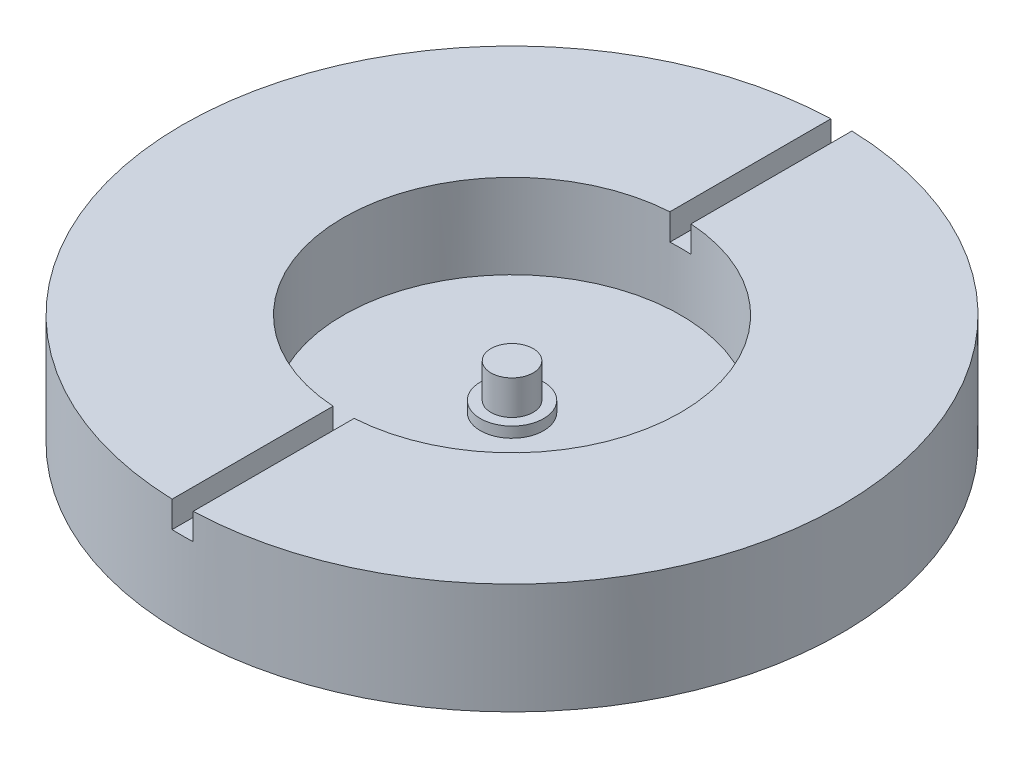
ISO-10303-21;
HEADER;
FILE_DESCRIPTION(('STEP AP214'),'2;1');
FILE_NAME('part.step','',(''),(''),'','','');
FILE_SCHEMA(('AUTOMOTIVE_DESIGN { 1 0 10303 214 1 1 1 1 }'));
ENDSEC;
DATA;
#1=APPLICATION_CONTEXT('core data for automotive mechanical design processes');
#2=APPLICATION_PROTOCOL_DEFINITION('international standard','automotive_design',2000,#1);
#3=PRODUCT_CONTEXT('',#1,'mechanical');
#4=PRODUCT('Part','Part','',(#3));
#5=PRODUCT_RELATED_PRODUCT_CATEGORY('part','',(#4));
#6=PRODUCT_DEFINITION_FORMATION('','',#4);
#7=PRODUCT_DEFINITION_CONTEXT('part definition',#1,'design');
#8=PRODUCT_DEFINITION('design','',#6,#7);
#9=PRODUCT_DEFINITION_SHAPE('','',#8);
#10=(LENGTH_UNIT() NAMED_UNIT(*) SI_UNIT(.MILLI.,.METRE.));
#11=(NAMED_UNIT(*) PLANE_ANGLE_UNIT() SI_UNIT($,.RADIAN.));
#12=(NAMED_UNIT(*) SI_UNIT($,.STERADIAN.) SOLID_ANGLE_UNIT());
#13=UNCERTAINTY_MEASURE_WITH_UNIT(LENGTH_MEASURE(1.E-05),#10,'distance_accuracy_value','');
#14=(GEOMETRIC_REPRESENTATION_CONTEXT(3) GLOBAL_UNCERTAINTY_ASSIGNED_CONTEXT((#13)) GLOBAL_UNIT_ASSIGNED_CONTEXT((#10,
#11,#12)) REPRESENTATION_CONTEXT('',''));
#15=CARTESIAN_POINT('',(0.,0.,0.));
#16=DIRECTION('',(0.,0.,1.));
#17=DIRECTION('',(1.,0.,0.));
#18=AXIS2_PLACEMENT_3D('',#15,#16,#17);
#19=CARTESIAN_POINT('',(0.,21.,0.));
#20=DIRECTION('',(0.,1.,0.));
#21=DIRECTION('',(0.,0.,1.));
#22=AXIS2_PLACEMENT_3D('',#19,#20,#21);
#23=PLANE('',#22);
#24=DIRECTION('',(0.,0.,-1.));
#25=VECTOR('',#24,1.);
#26=CARTESIAN_POINT('',(2.,21.,-62.467991803803));
#27=LINE('',#26,#25);
#28=CARTESIAN_POINT('',(2.,21.,62.467991803803));
#29=VERTEX_POINT('',#28);
#30=CARTESIAN_POINT('',(2.,21.,31.9374388453426));
#31=VERTEX_POINT('',#30);
#32=EDGE_CURVE('E113',#29,#31,#27,.T.);
#33=ORIENTED_EDGE('',*,*,#32,.F.);
#34=CARTESIAN_POINT('',(0.,21.,0.));
#35=DIRECTION('',(0.,1.,0.));
#36=DIRECTION('',(0.,0.,1.));
#37=AXIS2_PLACEMENT_3D('',#34,#35,#36);
#38=CIRCLE('',#37,62.5);
#39=CARTESIAN_POINT('',(2.,21.,-62.467991803803));
#40=VERTEX_POINT('',#39);
#41=EDGE_CURVE('E148',#29,#40,#38,.T.);
#42=ORIENTED_EDGE('',*,*,#41,.T.);
#43=CARTESIAN_POINT('',(2.,21.,-31.9374388453426));
#44=VERTEX_POINT('',#43);
#45=EDGE_CURVE('E174',#44,#40,#27,.T.);
#46=ORIENTED_EDGE('',*,*,#45,.F.);
#47=CARTESIAN_POINT('',(0.,21.,0.));
#48=DIRECTION('',(0.,1.,0.));
#49=DIRECTION('',(0.,0.,1.));
#50=AXIS2_PLACEMENT_3D('',#47,#48,#49);
#51=CIRCLE('',#50,32.);
#52=EDGE_CURVE('E145',#31,#44,#51,.T.);
#53=ORIENTED_EDGE('',*,*,#52,.F.);
#54=EDGE_LOOP('',(#33,#42,#46,#53));
#55=FACE_BOUND('',#54,.T.);
#56=ADVANCED_FACE('F33',(#55),#23,.T.);
#57=CARTESIAN_POINT('',(0.,7.,0.));
#58=DIRECTION('',(0.,1.,0.));
#59=DIRECTION('',(0.,0.,1.));
#60=AXIS2_PLACEMENT_3D('',#57,#58,#59);
#61=CYLINDRICAL_SURFACE('',#60,4.);
#62=CARTESIAN_POINT('',(0.,7.,0.));
#63=DIRECTION('',(0.,1.,0.));
#64=DIRECTION('',(0.,0.,1.));
#65=AXIS2_PLACEMENT_3D('',#62,#63,#64);
#66=CIRCLE('',#65,4.);
#67=CARTESIAN_POINT('',(0.,7.,4.));
#68=VERTEX_POINT('',#67);
#69=EDGE_CURVE('E130',#68,#68,#66,.T.);
#70=CARTESIAN_POINT('',(0.,13.5,0.));
#71=DIRECTION('',(0.,1.,0.));
#72=DIRECTION('',(0.,0.,1.));
#73=AXIS2_PLACEMENT_3D('',#70,#71,#72);
#74=CIRCLE('',#73,4.);
#75=CARTESIAN_POINT('',(0.,13.5,4.));
#76=VERTEX_POINT('',#75);
#77=EDGE_CURVE('E127',#76,#76,#74,.T.);
#78=CARTESIAN_POINT('',(0.,7.,4.));
#79=CARTESIAN_POINT('',(0.,7.06770833333334,4.));
#80=CARTESIAN_POINT('',(0.,7.13541666666667,4.));
#81=CARTESIAN_POINT('',(0.,7.27083333333334,4.));
#82=CARTESIAN_POINT('',(0.,7.33854166666667,4.));
#83=CARTESIAN_POINT('',(0.,7.47395833333334,4.));
#84=CARTESIAN_POINT('',(0.,7.54166666666667,4.));
#85=CARTESIAN_POINT('',(0.,7.67708333333333,4.));
#86=CARTESIAN_POINT('',(0.,7.74479166666667,4.));
#87=CARTESIAN_POINT('',(0.,7.88020833333333,4.));
#88=CARTESIAN_POINT('',(0.,7.94791666666667,4.));
#89=CARTESIAN_POINT('',(0.,8.08333333333333,4.));
#90=CARTESIAN_POINT('',(0.,8.15104166666667,4.));
#91=CARTESIAN_POINT('',(0.,8.28645833333334,4.));
#92=CARTESIAN_POINT('',(0.,8.35416666666667,4.));
#93=CARTESIAN_POINT('',(0.,8.48958333333334,4.));
#94=CARTESIAN_POINT('',(0.,8.55729166666667,4.));
#95=CARTESIAN_POINT('',(0.,8.69270833333334,4.));
#96=CARTESIAN_POINT('',(0.,8.76041666666667,4.));
#97=CARTESIAN_POINT('',(0.,8.89583333333334,4.));
#98=CARTESIAN_POINT('',(0.,8.96354166666667,4.));
#99=CARTESIAN_POINT('',(0.,9.09895833333333,4.));
#100=CARTESIAN_POINT('',(0.,9.16666666666667,4.));
#101=CARTESIAN_POINT('',(0.,9.30208333333333,4.));
#102=CARTESIAN_POINT('',(0.,9.36979166666667,4.));
#103=CARTESIAN_POINT('',(0.,9.50520833333333,4.));
#104=CARTESIAN_POINT('',(0.,9.57291666666667,4.));
#105=CARTESIAN_POINT('',(0.,9.70833333333333,4.));
#106=CARTESIAN_POINT('',(0.,9.77604166666667,4.));
#107=CARTESIAN_POINT('',(0.,9.91145833333333,4.));
#108=CARTESIAN_POINT('',(0.,9.97916666666667,4.));
#109=CARTESIAN_POINT('',(0.,10.1145833333333,4.));
#110=CARTESIAN_POINT('',(0.,10.1822916666667,4.));
#111=CARTESIAN_POINT('',(0.,10.3177083333333,4.));
#112=CARTESIAN_POINT('',(0.,10.3854166666667,4.));
#113=CARTESIAN_POINT('',(0.,10.5208333333333,4.));
#114=CARTESIAN_POINT('',(0.,10.5885416666667,4.));
#115=CARTESIAN_POINT('',(0.,10.7239583333333,4.));
#116=CARTESIAN_POINT('',(0.,10.7916666666667,4.));
#117=CARTESIAN_POINT('',(0.,10.9270833333333,4.));
#118=CARTESIAN_POINT('',(0.,10.9947916666667,4.));
#119=CARTESIAN_POINT('',(0.,11.1302083333333,4.));
#120=CARTESIAN_POINT('',(0.,11.1979166666667,4.));
#121=CARTESIAN_POINT('',(0.,11.3333333333333,4.));
#122=CARTESIAN_POINT('',(0.,11.4010416666667,4.));
#123=CARTESIAN_POINT('',(0.,11.5364583333333,4.));
#124=CARTESIAN_POINT('',(0.,11.6041666666667,4.));
#125=CARTESIAN_POINT('',(0.,11.7395833333333,4.));
#126=CARTESIAN_POINT('',(0.,11.8072916666667,4.));
#127=CARTESIAN_POINT('',(0.,11.9427083333333,4.));
#128=CARTESIAN_POINT('',(0.,12.0104166666667,4.));
#129=CARTESIAN_POINT('',(0.,12.1458333333333,4.));
#130=CARTESIAN_POINT('',(0.,12.2135416666667,4.));
#131=CARTESIAN_POINT('',(0.,12.3489583333333,4.));
#132=CARTESIAN_POINT('',(0.,12.4166666666667,4.));
#133=CARTESIAN_POINT('',(0.,12.5520833333333,4.));
#134=CARTESIAN_POINT('',(0.,12.6197916666667,4.));
#135=CARTESIAN_POINT('',(0.,12.7552083333333,4.));
#136=CARTESIAN_POINT('',(0.,12.8229166666667,4.));
#137=CARTESIAN_POINT('',(0.,12.9583333333333,4.));
#138=CARTESIAN_POINT('',(0.,13.0260416666667,4.));
#139=CARTESIAN_POINT('',(0.,13.1614583333333,4.));
#140=CARTESIAN_POINT('',(0.,13.2291666666667,4.));
#141=CARTESIAN_POINT('',(0.,13.3645833333333,4.));
#142=CARTESIAN_POINT('',(0.,13.4322916666667,4.));
#143=CARTESIAN_POINT('',(0.,13.5,4.));
#144=B_SPLINE_CURVE_WITH_KNOTS('',3,(#78,#79,#80,#81,#82,#83,#84,#85,#86,#87,#88,#89,#90,#91,
#92,#93,#94,#95,#96,#97,#98,#99,#100,#101,#102,#103,#104,#105,#106,#107,#108,#109,#110,#111,
#112,#113,#114,#115,#116,#117,#118,#119,#120,#121,#122,#123,#124,#125,#126,#127,#128,#129,#130,
#131,#132,#133,#134,#135,#136,#137,#138,#139,#140,#141,#142,#143),.UNSPECIFIED.,.F.,.F.,(4,2,2,
2,2,2,2,2,2,2,2,2,2,2,2,2,2,2,2,2,2,2,2,2,2,2,2,2,2,2,2,2,4),(0.,0.203124999999999,0.40625,
0.609375,0.812499999999999,1.015625,1.21875,1.421875,1.625,1.828125,2.03125,2.234375,2.4375,
2.640625,2.84375,3.046875,3.25,3.453125,3.65625,3.859375,4.0625,4.265625,4.46875,4.671875,4.875,
5.078125,5.28125,5.484375,5.6875,5.890625,6.09375,6.296875,6.5),.UNSPECIFIED.);
#145=EDGE_CURVE('BSEAM204',#68,#76,#144,.T.);
#146=ORIENTED_EDGE('',*,*,#69,.T.);
#147=ORIENTED_EDGE('',*,*,#77,.F.);
#148=ORIENTED_EDGE('',*,*,#145,.T.);
#149=ORIENTED_EDGE('',*,*,#145,.F.);
#150=EDGE_LOOP('',(#146,#148,#147,#149));
#151=FACE_BOUND('',#150,.T.);
#152=ADVANCED_FACE('F204',(#151),#61,.T.);
#153=CARTESIAN_POINT('',(0.,5.,0.));
#154=DIRECTION('',(0.,1.,0.));
#155=DIRECTION('',(0.,0.,1.));
#156=AXIS2_PLACEMENT_3D('',#153,#154,#155);
#157=CYLINDRICAL_SURFACE('',#156,6.);
#158=CARTESIAN_POINT('',(0.,5.,0.));
#159=DIRECTION('',(0.,1.,0.));
#160=DIRECTION('',(0.,0.,1.));
#161=AXIS2_PLACEMENT_3D('',#158,#159,#160);
#162=CIRCLE('',#161,6.);
#163=CARTESIAN_POINT('',(0.,5.,6.));
#164=VERTEX_POINT('',#163);
#165=EDGE_CURVE('E137',#164,#164,#162,.T.);
#166=ORIENTED_EDGE('',*,*,#165,.T.);
#167=EDGE_LOOP('',(#166));
#168=FACE_BOUND('',#167,.T.);
#169=CARTESIAN_POINT('',(0.,7.,0.));
#170=DIRECTION('',(0.,1.,0.));
#171=DIRECTION('',(0.,0.,1.));
#172=AXIS2_PLACEMENT_3D('',#169,#170,#171);
#173=CIRCLE('',#172,6.);
#174=CARTESIAN_POINT('',(0.,7.,6.));
#175=VERTEX_POINT('',#174);
#176=EDGE_CURVE('E134',#175,#175,#173,.T.);
#177=ORIENTED_EDGE('',*,*,#176,.F.);
#178=EDGE_LOOP('',(#177));
#179=FACE_BOUND('',#178,.T.);
#180=ADVANCED_FACE('F201',(#168,#179),#157,.T.);
#181=CARTESIAN_POINT('',(0.,21.,0.));
#182=DIRECTION('',(0.,-1.,0.));
#183=DIRECTION('',(0.,0.,-1.));
#184=AXIS2_PLACEMENT_3D('',#181,#182,#183);
#185=CYLINDRICAL_SURFACE('',#184,62.5);
#186=CARTESIAN_POINT('',(0.,16.,0.));
#187=DIRECTION('',(0.,1.,0.));
#188=DIRECTION('',(0.,0.,1.));
#189=AXIS2_PLACEMENT_3D('',#186,#187,#188);
#190=CIRCLE('',#189,62.5);
#191=CARTESIAN_POINT('',(2.,16.,-62.467991803803));
#192=VERTEX_POINT('',#191);
#193=CARTESIAN_POINT('',(-2.,16.,-62.467991803803));
#194=VERTEX_POINT('',#193);
#195=EDGE_CURVE('E106',#192,#194,#190,.T.);
#196=ORIENTED_EDGE('',*,*,#195,.F.);
#197=DIRECTION('',(0.,1.,0.));
#198=VECTOR('',#197,1.);
#199=CARTESIAN_POINT('',(2.,16.,-62.467991803803));
#200=LINE('',#199,#198);
#201=EDGE_CURVE('E131',#192,#40,#200,.T.);
#202=ORIENTED_EDGE('',*,*,#201,.T.);
#203=ORIENTED_EDGE('',*,*,#41,.F.);
#204=DIRECTION('',(0.,1.,0.));
#205=VECTOR('',#204,1.);
#206=CARTESIAN_POINT('',(2.,16.,62.467991803803));
#207=LINE('',#206,#205);
#208=CARTESIAN_POINT('',(2.,16.,62.467991803803));
#209=VERTEX_POINT('',#208);
#210=EDGE_CURVE('E122',#209,#29,#207,.T.);
#211=ORIENTED_EDGE('',*,*,#210,.F.);
#212=CARTESIAN_POINT('',(0.,16.,0.));
#213=DIRECTION('',(0.,1.,0.));
#214=DIRECTION('',(0.,0.,1.));
#215=AXIS2_PLACEMENT_3D('',#212,#213,#214);
#216=CIRCLE('',#215,62.5);
#217=CARTESIAN_POINT('',(-2.,16.,62.467991803803));
#218=VERTEX_POINT('',#217);
#219=EDGE_CURVE('E102',#218,#209,#216,.T.);
#220=ORIENTED_EDGE('',*,*,#219,.F.);
#221=DIRECTION('',(0.,1.,0.));
#222=VECTOR('',#221,1.);
#223=CARTESIAN_POINT('',(-2.,16.,62.467991803803));
#224=LINE('',#223,#222);
#225=CARTESIAN_POINT('',(-2.,21.,62.467991803803));
#226=VERTEX_POINT('',#225);
#227=EDGE_CURVE('E120',#218,#226,#224,.T.);
#228=ORIENTED_EDGE('',*,*,#227,.T.);
#229=CARTESIAN_POINT('',(-2.,21.,-62.467991803803));
#230=VERTEX_POINT('',#229);
#231=EDGE_CURVE('E119',#230,#226,#38,.T.);
#232=ORIENTED_EDGE('',*,*,#231,.F.);
#233=DIRECTION('',(0.,1.,0.));
#234=VECTOR('',#233,1.);
#235=CARTESIAN_POINT('',(-2.,16.,-62.467991803803));
#236=LINE('',#235,#234);
#237=EDGE_CURVE('E98',#194,#230,#236,.T.);
#238=ORIENTED_EDGE('',*,*,#237,.F.);
#239=EDGE_LOOP('',(#196,#202,#203,#211,#220,#228,#232,#238));
#240=FACE_BOUND('',#239,.T.);
#241=CARTESIAN_POINT('',(0.,0.,0.));
#242=DIRECTION('',(0.,1.,0.));
#243=DIRECTION('',(0.,0.,1.));
#244=AXIS2_PLACEMENT_3D('',#241,#242,#243);
#245=CIRCLE('',#244,62.5);
#246=CARTESIAN_POINT('',(0.,0.,62.5));
#247=VERTEX_POINT('',#246);
#248=EDGE_CURVE('E144',#247,#247,#245,.T.);
#249=ORIENTED_EDGE('',*,*,#248,.T.);
#250=EDGE_LOOP('',(#249));
#251=FACE_BOUND('',#250,.T.);
#252=ADVANCED_FACE('F35',(#240,#251),#185,.T.);
#253=DIRECTION('',(0.,0.,1.));
#254=VECTOR('',#253,1.);
#255=CARTESIAN_POINT('',(-2.,21.,-62.467991803803));
#256=LINE('',#255,#254);
#257=CARTESIAN_POINT('',(-2.,21.,-31.9374388453426));
#258=VERTEX_POINT('',#257);
#259=EDGE_CURVE('E175',#230,#258,#256,.T.);
#260=ORIENTED_EDGE('',*,*,#259,.F.);
#261=ORIENTED_EDGE('',*,*,#231,.T.);
#262=CARTESIAN_POINT('',(-2.,21.,31.9374388453426));
#263=VERTEX_POINT('',#262);
#264=EDGE_CURVE('E177',#263,#226,#256,.T.);
#265=ORIENTED_EDGE('',*,*,#264,.F.);
#266=EDGE_CURVE('E140',#258,#263,#51,.T.);
#267=ORIENTED_EDGE('',*,*,#266,.F.);
#268=EDGE_LOOP('',(#260,#261,#265,#267));
#269=FACE_BOUND('',#268,.T.);
#270=ADVANCED_FACE('F192',(#269),#23,.T.);
#271=CARTESIAN_POINT('',(0.,0.,0.));
#272=DIRECTION('',(0.,1.,0.));
#273=DIRECTION('',(0.,0.,1.));
#274=AXIS2_PLACEMENT_3D('',#271,#272,#273);
#275=PLANE('',#274);
#276=ORIENTED_EDGE('',*,*,#248,.F.);
#277=EDGE_LOOP('',(#276));
#278=FACE_BOUND('',#277,.T.);
#279=ADVANCED_FACE('F194',(#278),#275,.F.);
#280=CARTESIAN_POINT('',(0.,5.,0.));
#281=DIRECTION('',(0.,1.,0.));
#282=DIRECTION('',(0.,0.,1.));
#283=AXIS2_PLACEMENT_3D('',#280,#281,#282);
#284=CYLINDRICAL_SURFACE('',#283,32.);
#285=ORIENTED_EDGE('',*,*,#52,.T.);
#286=DIRECTION('',(0.,1.,0.));
#287=VECTOR('',#286,1.);
#288=CARTESIAN_POINT('',(2.,5.,-31.9374388453426));
#289=LINE('',#288,#287);
#290=CARTESIAN_POINT('',(2.,16.,-31.9374388453426));
#291=VERTEX_POINT('',#290);
#292=EDGE_CURVE('E11',#44,#291,#289,.F.);
#293=ORIENTED_EDGE('',*,*,#292,.T.);
#294=CARTESIAN_POINT('',(0.,16.,0.));
#295=DIRECTION('',(0.,1.,0.));
#296=DIRECTION('',(0.,0.,1.));
#297=AXIS2_PLACEMENT_3D('',#294,#295,#296);
#298=CIRCLE('',#297,32.);
#299=CARTESIAN_POINT('',(-2.,16.,-31.9374388453426));
#300=VERTEX_POINT('',#299);
#301=EDGE_CURVE('E156',#300,#291,#298,.F.);
#302=ORIENTED_EDGE('',*,*,#301,.F.);
#303=DIRECTION('',(0.,1.,0.));
#304=VECTOR('',#303,1.);
#305=CARTESIAN_POINT('',(-2.,5.,-31.9374388453426));
#306=LINE('',#305,#304);
#307=EDGE_CURVE('E41',#300,#258,#306,.T.);
#308=ORIENTED_EDGE('',*,*,#307,.T.);
#309=ORIENTED_EDGE('',*,*,#266,.T.);
#310=DIRECTION('',(0.,1.,0.));
#311=VECTOR('',#310,1.);
#312=CARTESIAN_POINT('',(-2.,5.,31.9374388453426));
#313=LINE('',#312,#311);
#314=CARTESIAN_POINT('',(-2.,16.,31.9374388453426));
#315=VERTEX_POINT('',#314);
#316=EDGE_CURVE('E155',#263,#315,#313,.F.);
#317=ORIENTED_EDGE('',*,*,#316,.T.);
#318=CARTESIAN_POINT('',(2.,16.,31.9374388453426));
#319=VERTEX_POINT('',#318);
#320=EDGE_CURVE('E151',#319,#315,#298,.F.);
#321=ORIENTED_EDGE('',*,*,#320,.F.);
#322=DIRECTION('',(0.,1.,0.));
#323=VECTOR('',#322,1.);
#324=CARTESIAN_POINT('',(2.,5.,31.9374388453426));
#325=LINE('',#324,#323);
#326=EDGE_CURVE('E159',#319,#31,#325,.T.);
#327=ORIENTED_EDGE('',*,*,#326,.T.);
#328=EDGE_LOOP('',(#285,#293,#302,#308,#309,#317,#321,#327));
#329=FACE_BOUND('',#328,.T.);
#330=CARTESIAN_POINT('',(0.,5.,0.));
#331=DIRECTION('',(0.,1.,0.));
#332=DIRECTION('',(0.,0.,1.));
#333=AXIS2_PLACEMENT_3D('',#330,#331,#332);
#334=CIRCLE('',#333,32.);
#335=CARTESIAN_POINT('',(0.,5.,32.));
#336=VERTEX_POINT('',#335);
#337=EDGE_CURVE('E141',#336,#336,#334,.T.);
#338=ORIENTED_EDGE('',*,*,#337,.F.);
#339=EDGE_LOOP('',(#338));
#340=FACE_BOUND('',#339,.T.);
#341=ADVANCED_FACE('F167',(#329,#340),#284,.F.);
#342=CARTESIAN_POINT('',(0.,5.,0.));
#343=DIRECTION('',(0.,1.,0.));
#344=DIRECTION('',(0.,0.,1.));
#345=AXIS2_PLACEMENT_3D('',#342,#343,#344);
#346=PLANE('',#345);
#347=ORIENTED_EDGE('',*,*,#165,.F.);
#348=EDGE_LOOP('',(#347));
#349=FACE_BOUND('',#348,.T.);
#350=ORIENTED_EDGE('',*,*,#337,.T.);
#351=EDGE_LOOP('',(#350));
#352=FACE_BOUND('',#351,.T.);
#353=ADVANCED_FACE('F222',(#349,#352),#346,.T.);
#354=CARTESIAN_POINT('',(0.,7.,0.));
#355=DIRECTION('',(0.,1.,0.));
#356=DIRECTION('',(0.,0.,1.));
#357=AXIS2_PLACEMENT_3D('',#354,#355,#356);
#358=PLANE('',#357);
#359=ORIENTED_EDGE('',*,*,#69,.F.);
#360=EDGE_LOOP('',(#359));
#361=FACE_BOUND('',#360,.T.);
#362=ORIENTED_EDGE('',*,*,#176,.T.);
#363=EDGE_LOOP('',(#362));
#364=FACE_BOUND('',#363,.T.);
#365=ADVANCED_FACE('F220',(#361,#364),#358,.T.);
#366=CARTESIAN_POINT('',(0.,13.5,0.));
#367=DIRECTION('',(0.,1.,0.));
#368=DIRECTION('',(0.,0.,1.));
#369=AXIS2_PLACEMENT_3D('',#366,#367,#368);
#370=PLANE('',#369);
#371=ORIENTED_EDGE('',*,*,#77,.T.);
#372=EDGE_LOOP('',(#371));
#373=FACE_BOUND('',#372,.T.);
#374=ADVANCED_FACE('F218',(#373),#370,.T.);
#375=CARTESIAN_POINT('',(0.,16.,0.));
#376=DIRECTION('',(0.,1.,0.));
#377=DIRECTION('',(0.,0.,1.));
#378=AXIS2_PLACEMENT_3D('',#375,#376,#377);
#379=PLANE('',#378);
#380=ORIENTED_EDGE('',*,*,#320,.T.);
#381=DIRECTION('',(0.,0.,1.));
#382=VECTOR('',#381,1.);
#383=CARTESIAN_POINT('',(-2.,16.,-62.467991803803));
#384=LINE('',#383,#382);
#385=EDGE_CURVE('E103',#315,#218,#384,.T.);
#386=ORIENTED_EDGE('',*,*,#385,.T.);
#387=ORIENTED_EDGE('',*,*,#219,.T.);
#388=DIRECTION('',(0.,0.,-1.));
#389=VECTOR('',#388,1.);
#390=CARTESIAN_POINT('',(2.,16.,-62.467991803803));
#391=LINE('',#390,#389);
#392=EDGE_CURVE('E56',#209,#319,#391,.T.);
#393=ORIENTED_EDGE('',*,*,#392,.T.);
#394=EDGE_LOOP('',(#380,#386,#387,#393));
#395=FACE_BOUND('',#394,.T.);
#396=ADVANCED_FACE('F186',(#395),#379,.T.);
#397=CARTESIAN_POINT('',(-2.,16.,-62.467991803803));
#398=DIRECTION('',(-1.,0.,0.));
#399=DIRECTION('',(0.,0.,1.));
#400=AXIS2_PLACEMENT_3D('',#397,#398,#399);
#401=PLANE('',#400);
#402=ORIENTED_EDGE('',*,*,#264,.T.);
#403=ORIENTED_EDGE('',*,*,#227,.F.);
#404=ORIENTED_EDGE('',*,*,#385,.F.);
#405=ORIENTED_EDGE('',*,*,#316,.F.);
#406=EDGE_LOOP('',(#402,#403,#404,#405));
#407=FACE_BOUND('',#406,.T.);
#408=ADVANCED_FACE('F189',(#407),#401,.F.);
#409=CARTESIAN_POINT('',(2.,16.,-62.467991803803));
#410=DIRECTION('',(1.,0.,0.));
#411=DIRECTION('',(0.,0.,-1.));
#412=AXIS2_PLACEMENT_3D('',#409,#410,#411);
#413=PLANE('',#412);
#414=ORIENTED_EDGE('',*,*,#392,.F.);
#415=ORIENTED_EDGE('',*,*,#210,.T.);
#416=ORIENTED_EDGE('',*,*,#32,.T.);
#417=ORIENTED_EDGE('',*,*,#326,.F.);
#418=EDGE_LOOP('',(#414,#415,#416,#417));
#419=FACE_BOUND('',#418,.T.);
#420=ADVANCED_FACE('F182',(#419),#413,.F.);
#421=ORIENTED_EDGE('',*,*,#45,.T.);
#422=ORIENTED_EDGE('',*,*,#201,.F.);
#423=EDGE_CURVE('E109',#291,#192,#391,.T.);
#424=ORIENTED_EDGE('',*,*,#423,.F.);
#425=ORIENTED_EDGE('',*,*,#292,.F.);
#426=EDGE_LOOP('',(#421,#422,#424,#425));
#427=FACE_BOUND('',#426,.T.);
#428=ADVANCED_FACE('F165',(#427),#413,.F.);
#429=EDGE_CURVE('E48',#194,#300,#384,.T.);
#430=ORIENTED_EDGE('',*,*,#429,.F.);
#431=ORIENTED_EDGE('',*,*,#237,.T.);
#432=ORIENTED_EDGE('',*,*,#259,.T.);
#433=ORIENTED_EDGE('',*,*,#307,.F.);
#434=EDGE_LOOP('',(#430,#431,#432,#433));
#435=FACE_BOUND('',#434,.T.);
#436=ADVANCED_FACE('F96',(#435),#401,.F.);
#437=ORIENTED_EDGE('',*,*,#301,.T.);
#438=ORIENTED_EDGE('',*,*,#423,.T.);
#439=ORIENTED_EDGE('',*,*,#195,.T.);
#440=ORIENTED_EDGE('',*,*,#429,.T.);
#441=EDGE_LOOP('',(#437,#438,#439,#440));
#442=FACE_BOUND('',#441,.T.);
#443=ADVANCED_FACE('F107',(#442),#379,.T.);
#444=CLOSED_SHELL('',(#56,#152,#180,#252,#270,#279,#341,#353,#365,#374,#396,#408,#420,#428,#436,#443));
#445=MANIFOLD_SOLID_BREP('B2',#444);
#446=ADVANCED_BREP_SHAPE_REPRESENTATION('',(#18,#445),#14);
#447=SHAPE_DEFINITION_REPRESENTATION(#9,#446);
ENDSEC;
END-ISO-10303-21;
